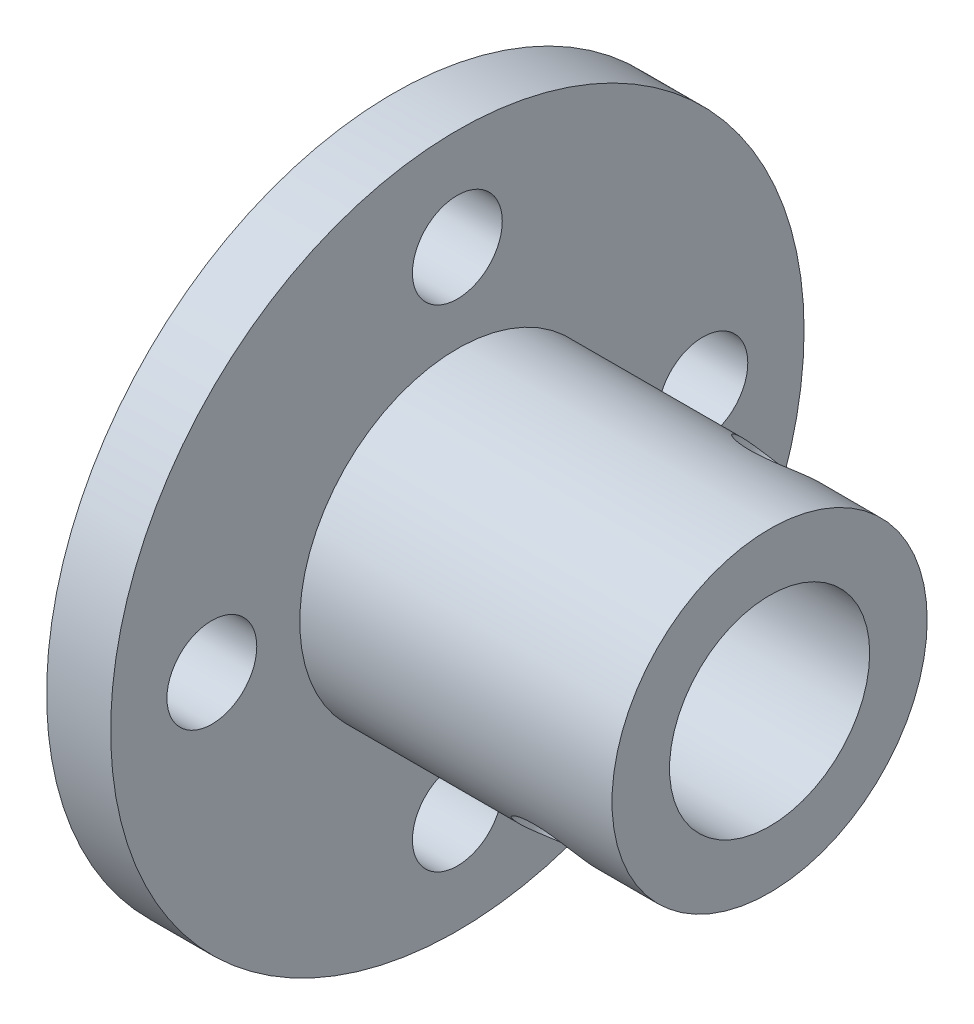
ISO-10303-21;
HEADER;
FILE_DESCRIPTION(('STEP AP214'),'2;1');
FILE_NAME('part.step','',(''),(''),'','','');
FILE_SCHEMA(('AUTOMOTIVE_DESIGN { 1 0 10303 214 1 1 1 1 }'));
ENDSEC;
DATA;
#1=APPLICATION_CONTEXT('core data for automotive mechanical design processes');
#2=APPLICATION_PROTOCOL_DEFINITION('international standard','automotive_design',2000,#1);
#3=PRODUCT_CONTEXT('',#1,'mechanical');
#4=PRODUCT('Part','Part','',(#3));
#5=PRODUCT_RELATED_PRODUCT_CATEGORY('part','',(#4));
#6=PRODUCT_DEFINITION_FORMATION('','',#4);
#7=PRODUCT_DEFINITION_CONTEXT('part definition',#1,'design');
#8=PRODUCT_DEFINITION('design','',#6,#7);
#9=PRODUCT_DEFINITION_SHAPE('','',#8);
#10=(LENGTH_UNIT() NAMED_UNIT(*) SI_UNIT(.MILLI.,.METRE.));
#11=(NAMED_UNIT(*) PLANE_ANGLE_UNIT() SI_UNIT($,.RADIAN.));
#12=(NAMED_UNIT(*) SI_UNIT($,.STERADIAN.) SOLID_ANGLE_UNIT());
#13=UNCERTAINTY_MEASURE_WITH_UNIT(LENGTH_MEASURE(1.E-05),#10,'distance_accuracy_value','');
#14=(GEOMETRIC_REPRESENTATION_CONTEXT(3) GLOBAL_UNCERTAINTY_ASSIGNED_CONTEXT((#13)) GLOBAL_UNIT_ASSIGNED_CONTEXT((#10,
#11,#12)) REPRESENTATION_CONTEXT('',''));
#15=CARTESIAN_POINT('',(0.,0.,0.));
#16=DIRECTION('',(0.,0.,1.));
#17=DIRECTION('',(1.,0.,0.));
#18=AXIS2_PLACEMENT_3D('',#15,#16,#17);
#19=CARTESIAN_POINT('',(-11.938,0.,0.));
#20=DIRECTION('',(1.,0.,0.));
#21=DIRECTION('',(0.,0.,-1.));
#22=AXIS2_PLACEMENT_3D('',#19,#20,#21);
#23=PLANE('',#22);
#24=CARTESIAN_POINT('',(-11.938,0.,-7.78885));
#25=DIRECTION('',(-1.,0.,0.));
#26=DIRECTION('',(0.,0.,1.));
#27=AXIS2_PLACEMENT_3D('',#24,#25,#26);
#28=CIRCLE('',#27,1.425);
#29=CARTESIAN_POINT('',(-11.938,0.,-6.36385));
#30=VERTEX_POINT('',#29);
#31=EDGE_CURVE('E139',#30,#30,#28,.T.);
#32=ORIENTED_EDGE('',*,*,#31,.F.);
#33=EDGE_LOOP('',(#32));
#34=FACE_BOUND('',#33,.T.);
#35=CARTESIAN_POINT('',(-11.938,7.78885,0.));
#36=DIRECTION('',(-1.,0.,0.));
#37=DIRECTION('',(0.,0.,1.));
#38=AXIS2_PLACEMENT_3D('',#35,#36,#37);
#39=CIRCLE('',#38,1.425);
#40=CARTESIAN_POINT('',(-11.938,7.78885,1.425));
#41=VERTEX_POINT('',#40);
#42=EDGE_CURVE('E143',#41,#41,#39,.T.);
#43=ORIENTED_EDGE('',*,*,#42,.F.);
#44=EDGE_LOOP('',(#43));
#45=FACE_BOUND('',#44,.T.);
#46=CARTESIAN_POINT('',(-11.938,0.,7.78885));
#47=DIRECTION('',(-1.,0.,0.));
#48=DIRECTION('',(0.,0.,1.));
#49=AXIS2_PLACEMENT_3D('',#46,#47,#48);
#50=CIRCLE('',#49,1.425);
#51=CARTESIAN_POINT('',(-11.938,0.,9.21385));
#52=VERTEX_POINT('',#51);
#53=EDGE_CURVE('E147',#52,#52,#50,.T.);
#54=ORIENTED_EDGE('',*,*,#53,.F.);
#55=EDGE_LOOP('',(#54));
#56=FACE_BOUND('',#55,.T.);
#57=CARTESIAN_POINT('',(-11.938,-7.78885,0.));
#58=DIRECTION('',(-1.,0.,0.));
#59=DIRECTION('',(0.,0.,1.));
#60=AXIS2_PLACEMENT_3D('',#57,#58,#59);
#61=CIRCLE('',#60,1.425);
#62=CARTESIAN_POINT('',(-11.938,-7.78885,1.425));
#63=VERTEX_POINT('',#62);
#64=EDGE_CURVE('E108',#63,#63,#61,.T.);
#65=ORIENTED_EDGE('',*,*,#64,.F.);
#66=EDGE_LOOP('',(#65));
#67=FACE_BOUND('',#66,.T.);
#68=CARTESIAN_POINT('',(-11.938,0.,0.));
#69=DIRECTION('',(1.,0.,0.));
#70=DIRECTION('',(0.,0.,-1.));
#71=AXIS2_PLACEMENT_3D('',#68,#69,#70);
#72=CIRCLE('',#71,11.);
#73=CARTESIAN_POINT('',(-11.938,0.,-11.));
#74=VERTEX_POINT('',#73);
#75=EDGE_CURVE('E153',#74,#74,#72,.T.);
#76=ORIENTED_EDGE('',*,*,#75,.F.);
#77=EDGE_LOOP('',(#76));
#78=FACE_BOUND('',#77,.T.);
#79=CARTESIAN_POINT('',(-11.938,0.,0.));
#80=DIRECTION('',(1.,0.,0.));
#81=DIRECTION('',(0.,0.,-1.));
#82=AXIS2_PLACEMENT_3D('',#79,#80,#81);
#83=CIRCLE('',#82,3.175);
#84=CARTESIAN_POINT('',(-11.938,0.,-3.175));
#85=VERTEX_POINT('',#84);
#86=EDGE_CURVE('E10',#85,#85,#83,.T.);
#87=ORIENTED_EDGE('',*,*,#86,.T.);
#88=EDGE_LOOP('',(#87));
#89=FACE_BOUND('',#88,.T.);
#90=ADVANCED_FACE('F47',(#34,#45,#56,#67,#78,#89),#23,.F.);
#91=CARTESIAN_POINT('',(0.,0.,0.));
#92=DIRECTION('',(1.,0.,0.));
#93=DIRECTION('',(0.,0.,-1.));
#94=AXIS2_PLACEMENT_3D('',#91,#92,#93);
#95=CYLINDRICAL_SURFACE('',#94,3.175);
#96=CARTESIAN_POINT('',(-3.175,-1.18531571732124,2.9454459170508));
#97=CARTESIAN_POINT('',(-3.10820522490351,-1.18532520272972,2.94544545209878));
#98=CARTESIAN_POINT('',(-3.04130920844585,-1.19078350386496,2.94326403595009));
#99=CARTESIAN_POINT('',(-2.90942877648725,-1.21227375963393,2.93447496314475));
#100=CARTESIAN_POINT('',(-2.8444498277304,-1.22833337580284,2.92785572637377));
#101=CARTESIAN_POINT('',(-2.71853185148499,-1.26990844034985,2.91006238398888));
#102=CARTESIAN_POINT('',(-2.65757893548869,-1.29538913822509,2.89890500277562));
#103=CARTESIAN_POINT('',(-2.54090017006314,-1.35439201432014,2.8718107110383));
#104=CARTESIAN_POINT('',(-2.48517303014912,-1.38791219990751,2.85587498460957));
#105=CARTESIAN_POINT('',(-2.37743521099699,-1.46329487068606,2.81802332836775));
#106=CARTESIAN_POINT('',(-2.32574744811578,-1.50548947169537,2.7958492806207));
#107=CARTESIAN_POINT('',(-2.23050395410471,-1.59525148300168,2.74562214224325));
#108=CARTESIAN_POINT('',(-2.18695100698427,-1.64282072377629,2.71756704586478));
#109=CARTESIAN_POINT('',(-2.10763184754397,-1.743349979853,2.65424385447025));
#110=CARTESIAN_POINT('',(-2.07222027751017,-1.79644548390872,2.61874408121105));
#111=CARTESIAN_POINT('',(-2.01257491555398,-1.90427749052981,2.54140605948194));
#112=CARTESIAN_POINT('',(-1.98833674520139,-1.95901334133551,2.49957030239558));
#113=CARTESIAN_POINT('',(-1.95286999577126,-2.0653747958403,2.41233472224327));
#114=CARTESIAN_POINT('',(-1.9410867273981,-2.11702627480597,2.36719258174913));
#115=CARTESIAN_POINT('',(-1.92908103100303,-2.21794998646935,2.27290233309657));
#116=CARTESIAN_POINT('',(-1.92885446806614,-2.26722306383974,2.22375566403671));
#117=CARTESIAN_POINT('',(-1.93965829169136,-2.35924605982314,2.12576115651534));
#118=CARTESIAN_POINT('',(-1.95008165688155,-2.40220452802739,2.07704040672811));
#119=CARTESIAN_POINT('',(-1.98086069149615,-2.48360950603291,1.97898242669964));
#120=CARTESIAN_POINT('',(-2.00121708715684,-2.52205568567102,1.92964515163926));
#121=CARTESIAN_POINT('',(-2.05153667964265,-2.59440442842553,1.8312505963935));
#122=CARTESIAN_POINT('',(-2.08163881445108,-2.62823055642144,1.78220850301178));
#123=CARTESIAN_POINT('',(-2.15046769253263,-2.69045675978407,1.68680652087234));
#124=CARTESIAN_POINT('',(-2.1891973393029,-2.71885500246174,1.64044754172067));
#125=CARTESIAN_POINT('',(-2.27704429599532,-2.77192191396967,1.54920440147364));
#126=CARTESIAN_POINT('',(-2.32666424355996,-2.79624033263148,1.50459973223676));
#127=CARTESIAN_POINT('',(-2.4334390090984,-2.83908951903919,1.42209763283211));
#128=CARTESIAN_POINT('',(-2.49059609048478,-2.85761854256676,1.38420222550575));
#129=CARTESIAN_POINT('',(-2.61273665594228,-2.88963015677392,1.31610027298298));
#130=CARTESIAN_POINT('',(-2.67788594791209,-2.90296782299005,1.28612117098703));
#131=CARTESIAN_POINT('',(-2.81300169276774,-2.92419920276942,1.23709591474252));
#132=CARTESIAN_POINT('',(-2.88296513397523,-2.93209628645096,1.21804299360105));
#133=CARTESIAN_POINT('',(-3.02129334408291,-2.94235420122695,1.19304223278875));
#134=CARTESIAN_POINT('',(-3.08950740835229,-2.94501520481247,1.18638510359652));
#135=CARTESIAN_POINT('',(-3.22611011470498,-2.94578025926488,1.18448579110348));
#136=CARTESIAN_POINT('',(-3.29449870150185,-2.9438856084566,1.18924035556117));
#137=CARTESIAN_POINT('',(-3.42564640192953,-2.93572234091165,1.20924071797064));
#138=CARTESIAN_POINT('',(-3.48851047186585,-2.92969442863371,1.22390856337214));
#139=CARTESIAN_POINT('',(-3.61085356541915,-2.91339120092615,1.26222303595051));
#140=CARTESIAN_POINT('',(-3.67033185386367,-2.9031149670083,1.28587160467203));
#141=CARTESIAN_POINT('',(-3.78684017484311,-2.87761570183278,1.34198951276894));
#142=CARTESIAN_POINT('',(-3.84367988066779,-2.8622128319736,1.37477117113271));
#143=CARTESIAN_POINT('',(-3.95108640966026,-2.82631562941494,1.44713314018884));
#144=CARTESIAN_POINT('',(-4.00165074645721,-2.805819288221,1.48671613092727));
#145=CARTESIAN_POINT('',(-4.09876919264077,-2.7578253712521,1.57406301044698));
#146=CARTESIAN_POINT('',(-4.1447903225675,-2.72993647155535,1.62220666758444));
#147=CARTESIAN_POINT('',(-4.22723397828936,-2.6678058373493,1.72247238524338));
#148=CARTESIAN_POINT('',(-4.26365624126449,-2.63356392893636,1.77459455464741));
#149=CARTESIAN_POINT('',(-4.32569560293402,-2.55887297740001,1.88068915478739));
#150=CARTESIAN_POINT('',(-4.35132767203841,-2.51843264107252,1.93465890892788));
#151=CARTESIAN_POINT('',(-4.39083643103051,-2.43190049750743,2.04236281961153));
#152=CARTESIAN_POINT('',(-4.40471921926974,-2.38581163632187,2.096097083957));
#153=CARTESIAN_POINT('',(-4.41963232199299,-2.29220219615373,2.19793438564197));
#154=CARTESIAN_POINT('',(-4.42141733258605,-2.24495480144677,2.24617890964152));
#155=CARTESIAN_POINT('',(-4.41406033580021,-2.14791999458276,2.33914016617591));
#156=CARTESIAN_POINT('',(-4.40491987097321,-2.09813294194631,2.38385739577417));
#157=CARTESIAN_POINT('',(-4.37650837810324,-1.99912695504403,2.46742743525798));
#158=CARTESIAN_POINT('',(-4.35753447113381,-1.94993247724703,2.50641136283846));
#159=CARTESIAN_POINT('',(-4.31030131870109,-1.85231779514871,2.5793917072627));
#160=CARTESIAN_POINT('',(-4.28204032907027,-1.8038977380807,2.61338718551086));
#161=CARTESIAN_POINT('',(-4.21564284497286,-1.70735113304063,2.67751421709143));
#162=CARTESIAN_POINT('',(-4.17712958018571,-1.65932937872352,2.70741275173847));
#163=CARTESIAN_POINT('',(-4.09189371258272,-1.56756201616389,2.76156082010736));
#164=CARTESIAN_POINT('',(-4.04516790764683,-1.52381808626401,2.78580814177719));
#165=CARTESIAN_POINT('',(-3.94157566135291,-1.43989054856325,2.83014580356028));
#166=CARTESIAN_POINT('',(-3.88427393853014,-1.40006858787561,2.84990702768786));
#167=CARTESIAN_POINT('',(-3.76295214667443,-1.32909437065571,2.88369302373458));
#168=CARTESIAN_POINT('',(-3.69893117513715,-1.29794328081982,2.89771702380904));
#169=CARTESIAN_POINT('',(-3.57169276887839,-1.24846703280914,2.91935271550661));
#170=CARTESIAN_POINT('',(-3.50889523849829,-1.22925806838964,2.92741813313343));
#171=CARTESIAN_POINT('',(-3.38079625090233,-1.20083183794707,2.93919613678769));
#172=CARTESIAN_POINT('',(-3.31550240502374,-1.19158637224899,2.94292101029636));
#173=CARTESIAN_POINT('',(-3.22498618614704,-1.1860719314443,2.94514073965111));
#174=CARTESIAN_POINT('',(-3.20000018443169,-1.18531216708903,2.94544609107468));
#175=CARTESIAN_POINT('',(-3.175,-1.18531571732124,2.9454459170508));
#176=B_SPLINE_CURVE_WITH_KNOTS('',3,(#96,#97,#98,#99,#100,#101,#102,#103,#104,#105,#106,#107,
#108,#109,#110,#111,#112,#113,#114,#115,#116,#117,#118,#119,#120,#121,#122,#123,#124,#125,#126,
#127,#128,#129,#130,#131,#132,#133,#134,#135,#136,#137,#138,#139,#140,#141,#142,#143,#144,#145,
#146,#147,#148,#149,#150,#151,#152,#153,#154,#155,#156,#157,#158,#159,#160,#161,#162,#163,#164,
#165,#166,#167,#168,#169,#170,#171,#172,#173,#174,#175),.UNSPECIFIED.,.T.,.F.,(4,2,2,2,2,2,2,2,
2,2,2,2,2,2,2,2,2,2,2,2,2,2,2,2,2,2,2,2,2,2,2,2,2,2,2,2,2,2,2,4),(0.,0.200308972497922,
0.401142679110004,0.601242865189921,0.801293506468985,1.01129870362666,1.22137564051188,
1.43935693229591,1.65725273274284,1.86497275537982,2.0726184566056,2.26905486229901,
2.46550563225182,2.66489041602224,2.86434240226122,3.07643003108504,3.28858149580437,
3.50629093613606,3.72386539682898,3.92855458951893,4.13318545435149,4.32681159783578,
4.520479625253,4.72181972789519,4.9232393507563,5.13883990148124,5.35444635480381,
5.56975268000678,5.78494718387042,5.98658266933128,6.18818968953514,6.38403244399568,
6.57991199989181,6.78432982498045,6.98882753137342,7.20537454714853,7.42195068602191,
7.61957530389314,7.81663910411976,7.89161145410577),.UNSPECIFIED.);
#177=CARTESIAN_POINT('',(-3.175,-1.18531571732124,2.9454459170508));
#178=VERTEX_POINT('',#177);
#179=EDGE_CURVE('E107',#178,#178,#176,.T.);
#180=ORIENTED_EDGE('',*,*,#179,.F.);
#181=EDGE_LOOP('',(#180));
#182=FACE_BOUND('',#181,.T.);
#183=CARTESIAN_POINT('',(-3.175,2.9454459170508,-1.18531571732125));
#184=CARTESIAN_POINT('',(-3.24179477509648,2.94544545209878,-1.18532520272974));
#185=CARTESIAN_POINT('',(-3.30869079155415,2.94326403595008,-1.19078350386497));
#186=CARTESIAN_POINT('',(-3.44057122351275,2.93447496314474,-1.21227375963393));
#187=CARTESIAN_POINT('',(-3.5055501722696,2.92785572637376,-1.22833337580285));
#188=CARTESIAN_POINT('',(-3.631468148515,2.91006238398887,-1.26990844034987));
#189=CARTESIAN_POINT('',(-3.69242106451131,2.89890500277562,-1.2953891382251));
#190=CARTESIAN_POINT('',(-3.80909982993685,2.87181071103829,-1.35439201432015));
#191=CARTESIAN_POINT('',(-3.86482696985088,2.85587498460956,-1.38791219990752));
#192=CARTESIAN_POINT('',(-3.97256478900301,2.81802332836774,-1.46329487068607));
#193=CARTESIAN_POINT('',(-4.02425255188421,2.7958492806207,-1.50548947169538));
#194=CARTESIAN_POINT('',(-4.11949604589529,2.74562214224324,-1.59525148300169));
#195=CARTESIAN_POINT('',(-4.16304899301573,2.71756704586478,-1.6428207237763));
#196=CARTESIAN_POINT('',(-4.24236815245602,2.65424385447024,-1.74334997985301));
#197=CARTESIAN_POINT('',(-4.27777972248983,2.61874408121104,-1.79644548390873));
#198=CARTESIAN_POINT('',(-4.33742508444602,2.54140605948193,-1.90427749052982));
#199=CARTESIAN_POINT('',(-4.3616632547986,2.49957030239558,-1.95901334133552));
#200=CARTESIAN_POINT('',(-4.39713000422874,2.41233472224326,-2.06537479584031));
#201=CARTESIAN_POINT('',(-4.40891327260189,2.36719258174912,-2.11702627480598));
#202=CARTESIAN_POINT('',(-4.42091896899697,2.27290233309656,-2.21794998646936));
#203=CARTESIAN_POINT('',(-4.42114553193385,2.2237556640367,-2.26722306383975));
#204=CARTESIAN_POINT('',(-4.41034170830864,2.12576115651533,-2.35924605982314));
#205=CARTESIAN_POINT('',(-4.39991834311844,2.0770404067281,-2.40220452802739));
#206=CARTESIAN_POINT('',(-4.36913930850385,1.97898242669963,-2.48360950603291));
#207=CARTESIAN_POINT('',(-4.34878291284315,1.92964515163925,-2.52205568567103));
#208=CARTESIAN_POINT('',(-4.29846332035734,1.8312505963935,-2.59440442842553));
#209=CARTESIAN_POINT('',(-4.26836118554892,1.78220850301177,-2.62823055642145));
#210=CARTESIAN_POINT('',(-4.19953230746736,1.68680652087234,-2.69045675978408));
#211=CARTESIAN_POINT('',(-4.16080266069709,1.64044754172066,-2.71885500246174));
#212=CARTESIAN_POINT('',(-4.07295570400468,1.54920440147363,-2.77192191396968));
#213=CARTESIAN_POINT('',(-4.02333575644004,1.50459973223675,-2.79624033263149));
#214=CARTESIAN_POINT('',(-3.9165609909016,1.4220976328321,-2.83908951903919));
#215=CARTESIAN_POINT('',(-3.85940390951521,1.38420222550574,-2.85761854256676));
#216=CARTESIAN_POINT('',(-3.73726334405772,1.31610027298297,-2.88963015677392));
#217=CARTESIAN_POINT('',(-3.67211405208791,1.28612117098702,-2.90296782299006));
#218=CARTESIAN_POINT('',(-3.53699830723226,1.23709591474251,-2.92419920276942));
#219=CARTESIAN_POINT('',(-3.46703486602476,1.21804299360104,-2.93209628645096));
#220=CARTESIAN_POINT('',(-3.32870665591709,1.19304223278874,-2.94235420122695));
#221=CARTESIAN_POINT('',(-3.2604925916477,1.18638510359651,-2.94501520481247));
#222=CARTESIAN_POINT('',(-3.12388988529501,1.18448579110347,-2.94578025926488));
#223=CARTESIAN_POINT('',(-3.05550129849815,1.18924035556116,-2.9438856084566));
#224=CARTESIAN_POINT('',(-2.92435359807047,1.20924071797063,-2.93572234091165));
#225=CARTESIAN_POINT('',(-2.86148952813415,1.22390856337213,-2.92969442863371));
#226=CARTESIAN_POINT('',(-2.73914643458085,1.2622230359505,-2.91339120092616));
#227=CARTESIAN_POINT('',(-2.67966814613632,1.28587160467202,-2.90311496700831));
#228=CARTESIAN_POINT('',(-2.56315982515689,1.34198951276893,-2.87761570183279));
#229=CARTESIAN_POINT('',(-2.5063201193322,1.3747711711327,-2.8622128319736));
#230=CARTESIAN_POINT('',(-2.39891359033973,1.44713314018883,-2.82631562941495));
#231=CARTESIAN_POINT('',(-2.34834925354279,1.48671613092726,-2.80581928822101));
#232=CARTESIAN_POINT('',(-2.25123080735923,1.57406301044697,-2.7578253712521));
#233=CARTESIAN_POINT('',(-2.2052096774325,1.62220666758443,-2.72993647155535));
#234=CARTESIAN_POINT('',(-2.12276602171064,1.72247238524337,-2.6678058373493));
#235=CARTESIAN_POINT('',(-2.0863437587355,1.7745945546474,-2.63356392893636));
#236=CARTESIAN_POINT('',(-2.02430439706598,1.88068915478738,-2.55887297740002));
#237=CARTESIAN_POINT('',(-1.99867232796159,1.93465890892787,-2.51843264107253));
#238=CARTESIAN_POINT('',(-1.95916356896948,2.04236281961152,-2.43190049750744));
#239=CARTESIAN_POINT('',(-1.94528078073026,2.096097083957,-2.38581163632187));
#240=CARTESIAN_POINT('',(-1.93036767800701,2.19793438564196,-2.29220219615373));
#241=CARTESIAN_POINT('',(-1.92858266741395,2.24617890964151,-2.24495480144678));
#242=CARTESIAN_POINT('',(-1.93593966419979,2.33914016617591,-2.14791999458277));
#243=CARTESIAN_POINT('',(-1.94508012902679,2.38385739577416,-2.09813294194632));
#244=CARTESIAN_POINT('',(-1.97349162189676,2.46742743525797,-1.99912695504404));
#245=CARTESIAN_POINT('',(-1.99246552886619,2.50641136283845,-1.94993247724704));
#246=CARTESIAN_POINT('',(-2.03969868129891,2.57939170726269,-1.85231779514872));
#247=CARTESIAN_POINT('',(-2.06795967092973,2.61338718551085,-1.80389773808071));
#248=CARTESIAN_POINT('',(-2.13435715502714,2.67751421709142,-1.70735113304064));
#249=CARTESIAN_POINT('',(-2.17287041981429,2.70741275173846,-1.65932937872353));
#250=CARTESIAN_POINT('',(-2.25810628741728,2.76156082010735,-1.5675620161639));
#251=CARTESIAN_POINT('',(-2.30483209235317,2.78580814177718,-1.52381808626402));
#252=CARTESIAN_POINT('',(-2.40842433864709,2.83014580356027,-1.43989054856326));
#253=CARTESIAN_POINT('',(-2.46572606146986,2.84990702768785,-1.40006858787562));
#254=CARTESIAN_POINT('',(-2.58704785332556,2.88369302373457,-1.32909437065572));
#255=CARTESIAN_POINT('',(-2.65106882486284,2.89771702380904,-1.29794328081983));
#256=CARTESIAN_POINT('',(-2.77830723112161,2.91935271550661,-1.24846703280915));
#257=CARTESIAN_POINT('',(-2.8411047615017,2.92741813313343,-1.22925806838965));
#258=CARTESIAN_POINT('',(-2.96920374909766,2.93919613678769,-1.20083183794708));
#259=CARTESIAN_POINT('',(-3.03449759497625,2.94292101029635,-1.191586372249));
#260=CARTESIAN_POINT('',(-3.12501381385296,2.94514073965111,-1.18607193144431));
#261=CARTESIAN_POINT('',(-3.14999981556831,2.94544609107468,-1.18531216708904));
#262=CARTESIAN_POINT('',(-3.175,2.9454459170508,-1.18531571732125));
#263=B_SPLINE_CURVE_WITH_KNOTS('',3,(#183,#184,#185,#186,#187,#188,#189,#190,#191,#192,#193,
#194,#195,#196,#197,#198,#199,#200,#201,#202,#203,#204,#205,#206,#207,#208,#209,#210,#211,#212,
#213,#214,#215,#216,#217,#218,#219,#220,#221,#222,#223,#224,#225,#226,#227,#228,#229,#230,#231,
#232,#233,#234,#235,#236,#237,#238,#239,#240,#241,#242,#243,#244,#245,#246,#247,#248,#249,#250,
#251,#252,#253,#254,#255,#256,#257,#258,#259,#260,#261,#262),.UNSPECIFIED.,.T.,.F.,(4,2,2,2,2,2,
2,2,2,2,2,2,2,2,2,2,2,2,2,2,2,2,2,2,2,2,2,2,2,2,2,2,2,2,2,2,2,2,2,4),(0.,0.200308972497923,
0.401142679110004,0.601242865189921,0.801293506468987,1.01129870362666,1.22137564051188,
1.43935693229591,1.65725273274284,1.86497275537982,2.0726184566056,2.26905486229901,
2.46550563225182,2.66489041602223,2.86434240226122,3.07643003108504,3.28858149580437,
3.50629093613605,3.72386539682898,3.92855458951893,4.13318545435149,4.32681159783578,
4.520479625253,4.72181972789519,4.92323935075629,5.13883990148124,5.35444635480381,
5.56975268000678,5.78494718387042,5.98658266933128,6.18818968953514,6.38403244399568,
6.5799119998918,6.78432982498044,6.98882753137342,7.20537454714852,7.42195068602191,
7.61957530389314,7.81663910411976,7.89161145410576),.UNSPECIFIED.);
#264=CARTESIAN_POINT('',(-3.175,2.9454459170508,-1.18531571732125));
#265=VERTEX_POINT('',#264);
#266=EDGE_CURVE('E100',#265,#265,#263,.T.);
#267=ORIENTED_EDGE('',*,*,#266,.F.);
#268=EDGE_LOOP('',(#267));
#269=FACE_BOUND('',#268,.T.);
#270=CARTESIAN_POINT('',(0.,0.,0.));
#271=DIRECTION('',(1.,0.,0.));
#272=DIRECTION('',(0.,0.,-1.));
#273=AXIS2_PLACEMENT_3D('',#270,#271,#272);
#274=CIRCLE('',#273,3.175);
#275=CARTESIAN_POINT('',(0.,0.,-3.175));
#276=VERTEX_POINT('',#275);
#277=EDGE_CURVE('E55',#276,#276,#274,.T.);
#278=ORIENTED_EDGE('',*,*,#277,.T.);
#279=EDGE_LOOP('',(#278));
#280=FACE_BOUND('',#279,.T.);
#281=ORIENTED_EDGE('',*,*,#86,.F.);
#282=EDGE_LOOP('',(#281));
#283=FACE_BOUND('',#282,.T.);
#284=ADVANCED_FACE('F114',(#182,#269,#280,#283),#95,.F.);
#285=CARTESIAN_POINT('',(0.,0.,0.));
#286=DIRECTION('',(1.,0.,0.));
#287=DIRECTION('',(0.,0.,-1.));
#288=AXIS2_PLACEMENT_3D('',#285,#286,#287);
#289=PLANE('',#288);
#290=CARTESIAN_POINT('',(0.,0.,0.));
#291=DIRECTION('',(1.,0.,0.));
#292=DIRECTION('',(0.,0.,-1.));
#293=AXIS2_PLACEMENT_3D('',#290,#291,#292);
#294=CIRCLE('',#293,5.);
#295=CARTESIAN_POINT('',(0.,0.,-5.));
#296=VERTEX_POINT('',#295);
#297=EDGE_CURVE('E63',#296,#296,#294,.T.);
#298=ORIENTED_EDGE('',*,*,#297,.T.);
#299=EDGE_LOOP('',(#298));
#300=FACE_BOUND('',#299,.T.);
#301=ORIENTED_EDGE('',*,*,#277,.F.);
#302=EDGE_LOOP('',(#301));
#303=FACE_BOUND('',#302,.T.);
#304=ADVANCED_FACE('F117',(#300,#303),#289,.T.);
#305=CARTESIAN_POINT('',(0.,0.,0.));
#306=DIRECTION('',(1.,0.,0.));
#307=DIRECTION('',(0.,0.,-1.));
#308=AXIS2_PLACEMENT_3D('',#305,#306,#307);
#309=CYLINDRICAL_SURFACE('',#308,5.);
#310=CARTESIAN_POINT('',(-3.175,-2.54418451428428,4.30431471401384));
#311=CARTESIAN_POINT('',(-3.24373747659569,-2.54418683886107,4.30431425312239));
#312=CARTESIAN_POINT('',(-3.31249681366802,-2.54927094697424,4.30132060746434));
#313=CARTESIAN_POINT('',(-3.44804164633323,-2.56935170193778,4.2893546961686));
#314=CARTESIAN_POINT('',(-3.51482595905155,-2.58435416828725,4.28037892054994));
#315=CARTESIAN_POINT('',(-3.64444054888859,-2.62349802646578,4.25649846690144));
#316=CARTESIAN_POINT('',(-3.70727578213003,-2.64762768527287,4.24160139945839));
#317=CARTESIAN_POINT('',(-3.82743137173596,-2.70391991730028,4.2059389678755));
#318=CARTESIAN_POINT('',(-3.88475150624985,-2.73608281347898,4.1851733678));
#319=CARTESIAN_POINT('',(-3.9935004095178,-2.80780407432814,4.13740548068463));
#320=CARTESIAN_POINT('',(-4.04479111801695,-2.84749546331676,4.11028855279339));
#321=CARTESIAN_POINT('',(-4.1388091941391,-2.93227056487006,4.05024480353233));
#322=CARTESIAN_POINT('',(-4.18153576643808,-2.97735477762888,4.01731744309961));
#323=CARTESIAN_POINT('',(-4.2577768896044,-3.07189333406017,3.94550854974877));
#324=CARTESIAN_POINT('',(-4.29115591609629,-3.12139947836655,3.90655099293851));
#325=CARTESIAN_POINT('',(-4.34687340873617,-3.22241352385637,3.82365188899287));
#326=CARTESIAN_POINT('',(-4.36921348936917,-3.27392113112948,3.77971107183347));
#327=CARTESIAN_POINT('',(-4.40177701639497,-3.37607448782454,3.68872653300695));
#328=CARTESIAN_POINT('',(-4.41223488382858,-3.4267167615226,3.64176288985187));
#329=CARTESIAN_POINT('',(-4.42147285236867,-3.52652533586116,3.5451992177467));
#330=CARTESIAN_POINT('',(-4.42025466570091,-3.57569185185225,3.49559957641132));
#331=CARTESIAN_POINT('',(-4.40634392537234,-3.67005065474344,3.39636804379531));
#332=CARTESIAN_POINT('',(-4.39390439349453,-3.71530657747822,3.34676086749195));
#333=CARTESIAN_POINT('',(-4.35831064890499,-3.80193943733464,3.24801072473233));
#334=CARTESIAN_POINT('',(-4.3351558685929,-3.84331616883094,3.19886778300789));
#335=CARTESIAN_POINT('',(-4.27858349776776,-3.92174677313142,3.10222719219546));
#336=CARTESIAN_POINT('',(-4.24507564930393,-3.95875850796946,3.05474827178967));
#337=CARTESIAN_POINT('',(-4.16881673164585,-4.02749826437284,2.9635324435579));
#338=CARTESIAN_POINT('',(-4.12606406674643,-4.05922537210733,2.91979618355654));
#339=CARTESIAN_POINT('',(-4.03117194688045,-4.11785614423098,2.8365342365553));
#340=CARTESIAN_POINT('',(-3.97881137625877,-4.1446075168514,2.79715304298196));
#341=CARTESIAN_POINT('',(-3.86689798662897,-4.19201783677206,2.72558882272796));
#342=CARTESIAN_POINT('',(-3.80734483756966,-4.21267650434199,2.69340612656351));
#343=CARTESIAN_POINT('',(-3.68232779446906,-4.2478839058459,2.63753352985458));
#344=CARTESIAN_POINT('',(-3.61683705273619,-4.26240301538235,2.61388488610475));
#345=CARTESIAN_POINT('',(-3.48204850313861,-4.28512221003283,2.5764727637386));
#346=CARTESIAN_POINT('',(-3.41275150534535,-4.29332363417689,2.56270719045286));
#347=CARTESIAN_POINT('',(-3.27426268288603,-4.30324427785362,2.54601282114654));
#348=CARTESIAN_POINT('',(-3.20511564719401,-4.30512766063774,2.54280961886341));
#349=CARTESIAN_POINT('',(-3.06720929374429,-4.30286484608128,2.54663681728799));
#350=CARTESIAN_POINT('',(-2.9984499412116,-4.29871919846564,2.55366628498436));
#351=CARTESIAN_POINT('',(-2.86441968231966,-4.28453387511392,2.57739275360853));
#352=CARTESIAN_POINT('',(-2.7991103237505,-4.27459069695955,2.59393141659041));
#353=CARTESIAN_POINT('',(-2.67255753089037,-4.24892645017495,2.63575838754024));
#354=CARTESIAN_POINT('',(-2.61131457604785,-4.23320470164682,2.6610477250789));
#355=CARTESIAN_POINT('',(-2.49331805263366,-4.19568276248211,2.71983105006527));
#356=CARTESIAN_POINT('',(-2.43667508369207,-4.17377020407792,2.75347516934076));
#357=CARTESIAN_POINT('',(-2.33067136243125,-4.12411396178364,2.82730599189673));
#358=CARTESIAN_POINT('',(-2.28131179844253,-4.09636932814252,2.86749376056727));
#359=CARTESIAN_POINT('',(-2.19002171957703,-4.03449286065678,2.95393918047931));
#360=CARTESIAN_POINT('',(-2.14830562163092,-4.00021978045273,3.00032257275524));
#361=CARTESIAN_POINT('',(-2.07504302682334,-3.9261646676356,3.09659710711247));
#362=CARTESIAN_POINT('',(-2.043496000738,-3.8863829218613,3.14648806648655));
#363=CARTESIAN_POINT('',(-1.99173977144148,-3.80229109762081,3.24759451938151));
#364=CARTESIAN_POINT('',(-1.97144928663152,-3.75801628833074,3.29879764798364));
#365=CARTESIAN_POINT('',(-1.94253769092944,-3.66569351886474,3.40109285120233));
#366=CARTESIAN_POINT('',(-1.93391434868407,-3.61764628202983,3.45218494518769));
#367=CARTESIAN_POINT('',(-1.92870643148228,-3.52042409979299,3.55123955006206));
#368=CARTESIAN_POINT('',(-1.93180529642031,-3.47131392314548,3.59924924126436));
#369=CARTESIAN_POINT('',(-1.94922937764122,-3.37223396902058,3.69224252981819));
#370=CARTESIAN_POINT('',(-1.96355426529903,-3.32226421674787,3.73722621570965));
#371=CARTESIAN_POINT('',(-2.00285459780948,-3.22333349003306,3.8228763455399));
#372=CARTESIAN_POINT('',(-2.02777324691973,-3.17436857514154,3.86356438785802));
#373=CARTESIAN_POINT('',(-2.08750213305335,-3.07878787961191,3.94015487634811));
#374=CARTESIAN_POINT('',(-2.12231360752686,-3.03217239371294,3.97605672300997));
#375=CARTESIAN_POINT('',(-2.20180786264168,-2.94181787134349,4.04338479354824));
#376=CARTESIAN_POINT('',(-2.24670571710361,-2.89817360953665,4.07468427025185));
#377=CARTESIAN_POINT('',(-2.34468007667724,-2.81663691055121,4.13146834363347));
#378=CARTESIAN_POINT('',(-2.39775864776122,-2.77874593112832,4.15695146739536));
#379=CARTESIAN_POINT('',(-2.51176672283177,-2.70961378136281,4.20234924517746));
#380=CARTESIAN_POINT('',(-2.57282302360576,-2.67850821888005,4.22215246967227));
#381=CARTESIAN_POINT('',(-2.70031082709298,-2.62529720590364,4.25544436154556));
#382=CARTESIAN_POINT('',(-2.76673835235788,-2.60318516746962,4.2689376521687));
#383=CARTESIAN_POINT('',(-2.89004696001823,-2.57230257388647,4.2876003516234));
#384=CARTESIAN_POINT('',(-2.94633482231432,-2.56179256033778,4.29386601631127));
#385=CARTESIAN_POINT('',(-3.06007676151226,-2.54773285006191,4.30222321549406));
#386=CARTESIAN_POINT('',(-3.11753074039889,-2.54418257077814,4.30431509935081));
#387=CARTESIAN_POINT('',(-3.175,-2.54418451428428,4.30431471401384));
#388=B_SPLINE_CURVE_WITH_KNOTS('',3,(#310,#311,#312,#313,#314,#315,#316,#317,#318,#319,#320,
#321,#322,#323,#324,#325,#326,#327,#328,#329,#330,#331,#332,#333,#334,#335,#336,#337,#338,#339,
#340,#341,#342,#343,#344,#345,#346,#347,#348,#349,#350,#351,#352,#353,#354,#355,#356,#357,#358,
#359,#360,#361,#362,#363,#364,#365,#366,#367,#368,#369,#370,#371,#372,#373,#374,#375,#376,#377,
#378,#379,#380,#381,#382,#383,#384,#385,#386,#387),.UNSPECIFIED.,.T.,.F.,(4,2,2,2,2,2,2,2,2,2,2,
2,2,2,2,2,2,2,2,2,2,2,2,2,2,2,2,2,2,2,2,2,2,2,2,2,2,2,4),(0.,0.206001400921095,
0.412123778536182,0.617982081043713,0.823848660957198,1.03376462184588,1.24370006793777,
1.4565379083884,1.66934461132926,1.87787575263332,2.08637631452014,2.29028993445966,
2.49421435719988,2.6999692990411,2.90575978368354,3.11707289026207,3.32839569720876,
3.54072684798053,3.75301298288666,3.95973864940787,4.1664454679344,4.36980616167729,
4.57319079019703,4.78053458498982,4.98791217182959,5.20042890984226,5.41293458616744,
5.62388512929112,5.83479532219674,6.04005103092486,6.2453007313228,6.44946364567621,
6.65365210912263,6.8626966624811,7.07179409507718,7.2847499130653,7.4975494543859,
7.66979521678851,7.84202656094102),.UNSPECIFIED.);
#389=CARTESIAN_POINT('',(-3.175,-2.54418451428428,4.30431471401384));
#390=VERTEX_POINT('',#389);
#391=EDGE_CURVE('E76',#390,#390,#388,.T.);
#392=ORIENTED_EDGE('',*,*,#391,.F.);
#393=EDGE_LOOP('',(#392));
#394=FACE_BOUND('',#393,.T.);
#395=CARTESIAN_POINT('',(-3.175,4.30431471401384,-2.54418451428429));
#396=CARTESIAN_POINT('',(-3.10626252340431,4.30431425312238,-2.54418683886109));
#397=CARTESIAN_POINT('',(-3.03750318633198,4.30132060746434,-2.54927094697425));
#398=CARTESIAN_POINT('',(-2.90195835366676,4.28935469616859,-2.56935170193779));
#399=CARTESIAN_POINT('',(-2.83517404094845,4.28037892054993,-2.58435416828726));
#400=CARTESIAN_POINT('',(-2.70555945111141,4.25649846690144,-2.6234980264658));
#401=CARTESIAN_POINT('',(-2.64272421786997,4.24160139945838,-2.64762768527288));
#402=CARTESIAN_POINT('',(-2.52256862826403,4.20593896787549,-2.70391991730029));
#403=CARTESIAN_POINT('',(-2.46524849375015,4.18517336779999,-2.736082813479));
#404=CARTESIAN_POINT('',(-2.3564995904822,4.13740548068462,-2.80780407432816));
#405=CARTESIAN_POINT('',(-2.30520888198304,4.11028855279338,-2.84749546331677));
#406=CARTESIAN_POINT('',(-2.21119080586089,4.05024480353232,-2.93227056487007));
#407=CARTESIAN_POINT('',(-2.16846423356192,4.0173174430996,-2.97735477762889));
#408=CARTESIAN_POINT('',(-2.09222311039559,3.94550854974876,-3.07189333406019));
#409=CARTESIAN_POINT('',(-2.0588440839037,3.9065509929385,-3.12139947836657));
#410=CARTESIAN_POINT('',(-2.00312659126383,3.82365188899286,-3.22241352385638));
#411=CARTESIAN_POINT('',(-1.98078651063083,3.77971107183346,-3.27392113112949));
#412=CARTESIAN_POINT('',(-1.94822298360503,3.68872653300694,-3.37607448782455));
#413=CARTESIAN_POINT('',(-1.93776511617142,3.64176288985186,-3.42671676152261));
#414=CARTESIAN_POINT('',(-1.92852714763133,3.54519921774669,-3.52652533586117));
#415=CARTESIAN_POINT('',(-1.92974533429908,3.49559957641131,-3.57569185185226));
#416=CARTESIAN_POINT('',(-1.94365607462765,3.39636804379529,-3.67005065474345));
#417=CARTESIAN_POINT('',(-1.95609560650547,3.34676086749194,-3.71530657747823));
#418=CARTESIAN_POINT('',(-1.99168935109501,3.24801072473232,-3.80193943733465));
#419=CARTESIAN_POINT('',(-2.0148441314071,3.19886778300788,-3.84331616883095));
#420=CARTESIAN_POINT('',(-2.07141650223223,3.10222719219545,-3.92174677313143));
#421=CARTESIAN_POINT('',(-2.10492435069607,3.05474827178966,-3.95875850796947));
#422=CARTESIAN_POINT('',(-2.18118326835415,2.96353244355788,-4.02749826437285));
#423=CARTESIAN_POINT('',(-2.22393593325357,2.91979618355652,-4.05922537210734));
#424=CARTESIAN_POINT('',(-2.31882805311955,2.83653423655529,-4.11785614423099));
#425=CARTESIAN_POINT('',(-2.37118862374122,2.79715304298194,-4.14460751685141));
#426=CARTESIAN_POINT('',(-2.48310201337102,2.72558882272794,-4.19201783677207));
#427=CARTESIAN_POINT('',(-2.54265516243034,2.6934061265635,-4.212676504342));
#428=CARTESIAN_POINT('',(-2.66767220553094,2.63753352985457,-4.24788390584591));
#429=CARTESIAN_POINT('',(-2.73316294726381,2.61388488610473,-4.26240301538236));
#430=CARTESIAN_POINT('',(-2.86795149686139,2.57647276373858,-4.28512221003283));
#431=CARTESIAN_POINT('',(-2.93724849465465,2.56270719045284,-4.29332363417689));
#432=CARTESIAN_POINT('',(-3.07573731711397,2.54601282114653,-4.30324427785363));
#433=CARTESIAN_POINT('',(-3.14488435280598,2.5428096188634,-4.30512766063775));
#434=CARTESIAN_POINT('',(-3.28279070625571,2.54663681728797,-4.30286484608129));
#435=CARTESIAN_POINT('',(-3.3515500587884,2.55366628498434,-4.29871919846565));
#436=CARTESIAN_POINT('',(-3.48558031768034,2.57739275360852,-4.28453387511393));
#437=CARTESIAN_POINT('',(-3.5508896762495,2.59393141659039,-4.27459069695956));
#438=CARTESIAN_POINT('',(-3.67744246910963,2.63575838754023,-4.24892645017496));
#439=CARTESIAN_POINT('',(-3.73868542395215,2.66104772507888,-4.23320470164682));
#440=CARTESIAN_POINT('',(-3.85668194736634,2.71983105006525,-4.19568276248212));
#441=CARTESIAN_POINT('',(-3.91332491630793,2.75347516934074,-4.17377020407792));
#442=CARTESIAN_POINT('',(-4.01932863756875,2.82730599189672,-4.12411396178365));
#443=CARTESIAN_POINT('',(-4.06868820155747,2.86749376056726,-4.09636932814253));
#444=CARTESIAN_POINT('',(-4.15997828042297,2.95393918047929,-4.03449286065679));
#445=CARTESIAN_POINT('',(-4.20169437836907,3.00032257275523,-4.00021978045274));
#446=CARTESIAN_POINT('',(-4.27495697317665,3.09659710711245,-3.92616466763561));
#447=CARTESIAN_POINT('',(-4.30650399926199,3.14648806648654,-3.88638292186131));
#448=CARTESIAN_POINT('',(-4.35826022855852,3.24759451938149,-3.80229109762082));
#449=CARTESIAN_POINT('',(-4.37855071336847,3.29879764798363,-3.75801628833075));
#450=CARTESIAN_POINT('',(-4.40746230907056,3.40109285120232,-3.66569351886475));
#451=CARTESIAN_POINT('',(-4.41608565131593,3.45218494518768,-3.61764628202984));
#452=CARTESIAN_POINT('',(-4.42129356851772,3.55123955006204,-3.520424099793));
#453=CARTESIAN_POINT('',(-4.41819470357969,3.59924924126434,-3.47131392314549));
#454=CARTESIAN_POINT('',(-4.40077062235878,3.69224252981817,-3.3722339690206));
#455=CARTESIAN_POINT('',(-4.38644573470097,3.73722621570964,-3.32226421674788));
#456=CARTESIAN_POINT('',(-4.34714540219051,3.82287634553989,-3.22333349003308));
#457=CARTESIAN_POINT('',(-4.32222675308026,3.86356438785801,-3.17436857514155));
#458=CARTESIAN_POINT('',(-4.26249786694665,3.9401548763481,-3.07878787961192));
#459=CARTESIAN_POINT('',(-4.22768639247313,3.97605672300996,-3.03217239371295));
#460=CARTESIAN_POINT('',(-4.14819213735831,4.04338479354823,-2.94181787134351));
#461=CARTESIAN_POINT('',(-4.10329428289639,4.07468427025184,-2.89817360953667));
#462=CARTESIAN_POINT('',(-4.00531992332276,4.13146834363346,-2.81663691055122));
#463=CARTESIAN_POINT('',(-3.95224135223878,4.15695146739535,-2.77874593112833));
#464=CARTESIAN_POINT('',(-3.83823327716823,4.20234924517745,-2.70961378136282));
#465=CARTESIAN_POINT('',(-3.77717697639423,4.22215246967226,-2.67850821888006));
#466=CARTESIAN_POINT('',(-3.64968917290701,4.25544436154555,-2.62529720590366));
#467=CARTESIAN_POINT('',(-3.58326164764212,4.2689376521687,-2.60318516746964));
#468=CARTESIAN_POINT('',(-3.45995303998177,4.2876003516234,-2.57230257388649));
#469=CARTESIAN_POINT('',(-3.40366517768568,4.29386601631126,-2.56179256033779));
#470=CARTESIAN_POINT('',(-3.28992323848774,4.30222321549406,-2.54773285006193));
#471=CARTESIAN_POINT('',(-3.23246925960111,4.3043150993508,-2.54418257077816));
#472=CARTESIAN_POINT('',(-3.175,4.30431471401384,-2.54418451428429));
#473=B_SPLINE_CURVE_WITH_KNOTS('',3,(#395,#396,#397,#398,#399,#400,#401,#402,#403,#404,#405,
#406,#407,#408,#409,#410,#411,#412,#413,#414,#415,#416,#417,#418,#419,#420,#421,#422,#423,#424,
#425,#426,#427,#428,#429,#430,#431,#432,#433,#434,#435,#436,#437,#438,#439,#440,#441,#442,#443,
#444,#445,#446,#447,#448,#449,#450,#451,#452,#453,#454,#455,#456,#457,#458,#459,#460,#461,#462,
#463,#464,#465,#466,#467,#468,#469,#470,#471,#472),.UNSPECIFIED.,.T.,.F.,(4,2,2,2,2,2,2,2,2,2,2,
2,2,2,2,2,2,2,2,2,2,2,2,2,2,2,2,2,2,2,2,2,2,2,2,2,2,2,4),(0.,0.206001400921096,
0.412123778536182,0.617982081043713,0.823848660957198,1.03376462184588,1.24370006793777,
1.4565379083884,1.66934461132926,1.87787575263332,2.08637631452014,2.29028993445966,
2.49421435719988,2.6999692990411,2.90575978368354,3.11707289026207,3.32839569720876,
3.54072684798053,3.75301298288666,3.95973864940787,4.1664454679344,4.36980616167729,
4.57319079019702,4.78053458498982,4.98791217182959,5.20042890984226,5.41293458616744,
5.62388512929112,5.83479532219674,6.04005103092486,6.2453007313228,6.44946364567621,
6.65365210912263,6.8626966624811,7.07179409507718,7.2847499130653,7.4975494543859,
7.66979521678851,7.84202656094102),.UNSPECIFIED.);
#474=CARTESIAN_POINT('',(-3.175,4.30431471401384,-2.54418451428429));
#475=VERTEX_POINT('',#474);
#476=EDGE_CURVE('E67',#475,#475,#473,.T.);
#477=ORIENTED_EDGE('',*,*,#476,.F.);
#478=EDGE_LOOP('',(#477));
#479=FACE_BOUND('',#478,.T.);
#480=CARTESIAN_POINT('',(-9.906,0.,0.));
#481=DIRECTION('',(1.,0.,0.));
#482=DIRECTION('',(0.,0.,-1.));
#483=AXIS2_PLACEMENT_3D('',#480,#481,#482);
#484=CIRCLE('',#483,5.);
#485=CARTESIAN_POINT('',(-9.906,0.,-5.));
#486=VERTEX_POINT('',#485);
#487=EDGE_CURVE('E160',#486,#486,#484,.T.);
#488=ORIENTED_EDGE('',*,*,#487,.T.);
#489=EDGE_LOOP('',(#488));
#490=FACE_BOUND('',#489,.T.);
#491=ORIENTED_EDGE('',*,*,#297,.F.);
#492=EDGE_LOOP('',(#491));
#493=FACE_BOUND('',#492,.T.);
#494=ADVANCED_FACE('F81',(#394,#479,#490,#493),#309,.T.);
#495=CARTESIAN_POINT('',(-9.906,0.,0.));
#496=DIRECTION('',(1.,0.,0.));
#497=DIRECTION('',(0.,0.,-1.));
#498=AXIS2_PLACEMENT_3D('',#495,#496,#497);
#499=PLANE('',#498);
#500=CARTESIAN_POINT('',(-9.906,0.,-7.78885));
#501=DIRECTION('',(1.,0.,0.));
#502=DIRECTION('',(0.,0.,-1.));
#503=AXIS2_PLACEMENT_3D('',#500,#501,#502);
#504=CIRCLE('',#503,1.425);
#505=CARTESIAN_POINT('',(-9.906,0.,-9.21385));
#506=VERTEX_POINT('',#505);
#507=EDGE_CURVE('E50',#506,#506,#504,.T.);
#508=ORIENTED_EDGE('',*,*,#507,.F.);
#509=EDGE_LOOP('',(#508));
#510=FACE_BOUND('',#509,.T.);
#511=CARTESIAN_POINT('',(-9.906,7.78885,0.));
#512=DIRECTION('',(1.,0.,0.));
#513=DIRECTION('',(0.,0.,-1.));
#514=AXIS2_PLACEMENT_3D('',#511,#512,#513);
#515=CIRCLE('',#514,1.425);
#516=CARTESIAN_POINT('',(-9.906,7.78885,-1.425));
#517=VERTEX_POINT('',#516);
#518=EDGE_CURVE('E170',#517,#517,#515,.T.);
#519=ORIENTED_EDGE('',*,*,#518,.F.);
#520=EDGE_LOOP('',(#519));
#521=FACE_BOUND('',#520,.T.);
#522=CARTESIAN_POINT('',(-9.906,0.,7.78885));
#523=DIRECTION('',(1.,0.,0.));
#524=DIRECTION('',(0.,0.,-1.));
#525=AXIS2_PLACEMENT_3D('',#522,#523,#524);
#526=CIRCLE('',#525,1.425);
#527=CARTESIAN_POINT('',(-9.906,0.,6.36385));
#528=VERTEX_POINT('',#527);
#529=EDGE_CURVE('E176',#528,#528,#526,.T.);
#530=ORIENTED_EDGE('',*,*,#529,.F.);
#531=EDGE_LOOP('',(#530));
#532=FACE_BOUND('',#531,.T.);
#533=CARTESIAN_POINT('',(-9.906,-7.78885,0.));
#534=DIRECTION('',(1.,0.,0.));
#535=DIRECTION('',(0.,0.,-1.));
#536=AXIS2_PLACEMENT_3D('',#533,#534,#535);
#537=CIRCLE('',#536,1.425);
#538=CARTESIAN_POINT('',(-9.906,-7.78885,-1.425));
#539=VERTEX_POINT('',#538);
#540=EDGE_CURVE('E180',#539,#539,#537,.T.);
#541=ORIENTED_EDGE('',*,*,#540,.F.);
#542=EDGE_LOOP('',(#541));
#543=FACE_BOUND('',#542,.T.);
#544=CARTESIAN_POINT('',(-9.906,0.,0.));
#545=DIRECTION('',(1.,0.,0.));
#546=DIRECTION('',(0.,0.,-1.));
#547=AXIS2_PLACEMENT_3D('',#544,#545,#546);
#548=CIRCLE('',#547,11.);
#549=CARTESIAN_POINT('',(-9.906,0.,-11.));
#550=VERTEX_POINT('',#549);
#551=EDGE_CURVE('E156',#550,#550,#548,.T.);
#552=ORIENTED_EDGE('',*,*,#551,.T.);
#553=EDGE_LOOP('',(#552));
#554=FACE_BOUND('',#553,.T.);
#555=ORIENTED_EDGE('',*,*,#487,.F.);
#556=EDGE_LOOP('',(#555));
#557=FACE_BOUND('',#556,.T.);
#558=ADVANCED_FACE('F126',(#510,#521,#532,#543,#554,#557),#499,.T.);
#559=CARTESIAN_POINT('',(0.,0.,0.));
#560=DIRECTION('',(1.,0.,0.));
#561=DIRECTION('',(0.,0.,-1.));
#562=AXIS2_PLACEMENT_3D('',#559,#560,#561);
#563=CYLINDRICAL_SURFACE('',#562,11.);
#564=ORIENTED_EDGE('',*,*,#75,.T.);
#565=EDGE_LOOP('',(#564));
#566=FACE_BOUND('',#565,.T.);
#567=ORIENTED_EDGE('',*,*,#551,.F.);
#568=EDGE_LOOP('',(#567));
#569=FACE_BOUND('',#568,.T.);
#570=ADVANCED_FACE('F91',(#566,#569),#563,.T.);
#571=CARTESIAN_POINT('',(-3.175,-11.,11.));
#572=DIRECTION('',(0.,0.707106781186546,-0.707106781186549));
#573=DIRECTION('',(0.,0.707106781186549,0.707106781186546));
#574=AXIS2_PLACEMENT_3D('',#571,#572,#573);
#575=CYLINDRICAL_SURFACE('',#574,1.2446);
#576=ORIENTED_EDGE('',*,*,#266,.T.);
#577=EDGE_LOOP('',(#576));
#578=FACE_BOUND('',#577,.T.);
#579=ORIENTED_EDGE('',*,*,#476,.T.);
#580=EDGE_LOOP('',(#579));
#581=FACE_BOUND('',#580,.T.);
#582=ADVANCED_FACE('F85',(#578,#581),#575,.F.);
#583=ORIENTED_EDGE('',*,*,#179,.T.);
#584=EDGE_LOOP('',(#583));
#585=FACE_BOUND('',#584,.T.);
#586=ORIENTED_EDGE('',*,*,#391,.T.);
#587=EDGE_LOOP('',(#586));
#588=FACE_BOUND('',#587,.T.);
#589=ADVANCED_FACE('F90',(#585,#588),#575,.F.);
#590=CARTESIAN_POINT('',(0.,-7.78885,0.));
#591=DIRECTION('',(-1.,0.,0.));
#592=DIRECTION('',(0.,0.,1.));
#593=AXIS2_PLACEMENT_3D('',#590,#591,#592);
#594=CYLINDRICAL_SURFACE('',#593,1.425);
#595=ORIENTED_EDGE('',*,*,#540,.T.);
#596=EDGE_LOOP('',(#595));
#597=FACE_BOUND('',#596,.T.);
#598=ORIENTED_EDGE('',*,*,#64,.T.);
#599=EDGE_LOOP('',(#598));
#600=FACE_BOUND('',#599,.T.);
#601=ADVANCED_FACE('F93',(#597,#600),#594,.F.);
#602=CARTESIAN_POINT('',(0.,0.,7.78885));
#603=DIRECTION('',(-1.,0.,0.));
#604=DIRECTION('',(0.,0.,1.));
#605=AXIS2_PLACEMENT_3D('',#602,#603,#604);
#606=CYLINDRICAL_SURFACE('',#605,1.425);
#607=ORIENTED_EDGE('',*,*,#529,.T.);
#608=EDGE_LOOP('',(#607));
#609=FACE_BOUND('',#608,.T.);
#610=ORIENTED_EDGE('',*,*,#53,.T.);
#611=EDGE_LOOP('',(#610));
#612=FACE_BOUND('',#611,.T.);
#613=ADVANCED_FACE('F193',(#609,#612),#606,.F.);
#614=CARTESIAN_POINT('',(0.,7.78885,0.));
#615=DIRECTION('',(-1.,0.,0.));
#616=DIRECTION('',(0.,0.,1.));
#617=AXIS2_PLACEMENT_3D('',#614,#615,#616);
#618=CYLINDRICAL_SURFACE('',#617,1.425);
#619=ORIENTED_EDGE('',*,*,#518,.T.);
#620=EDGE_LOOP('',(#619));
#621=FACE_BOUND('',#620,.T.);
#622=ORIENTED_EDGE('',*,*,#42,.T.);
#623=EDGE_LOOP('',(#622));
#624=FACE_BOUND('',#623,.T.);
#625=ADVANCED_FACE('F197',(#621,#624),#618,.F.);
#626=CARTESIAN_POINT('',(0.,0.,-7.78885));
#627=DIRECTION('',(-1.,0.,0.));
#628=DIRECTION('',(0.,0.,1.));
#629=AXIS2_PLACEMENT_3D('',#626,#627,#628);
#630=CYLINDRICAL_SURFACE('',#629,1.425);
#631=ORIENTED_EDGE('',*,*,#507,.T.);
#632=EDGE_LOOP('',(#631));
#633=FACE_BOUND('',#632,.T.);
#634=ORIENTED_EDGE('',*,*,#31,.T.);
#635=EDGE_LOOP('',(#634));
#636=FACE_BOUND('',#635,.T.);
#637=ADVANCED_FACE('F264',(#633,#636),#630,.F.);
#638=CLOSED_SHELL('',(#90,#284,#304,#494,#558,#570,#582,#589,#601,#613,#625,#637));
#639=MANIFOLD_SOLID_BREP('B2',#638);
#640=ADVANCED_BREP_SHAPE_REPRESENTATION('',(#18,#639),#14);
#641=SHAPE_DEFINITION_REPRESENTATION(#9,#640);
ENDSEC;
END-ISO-10303-21;
